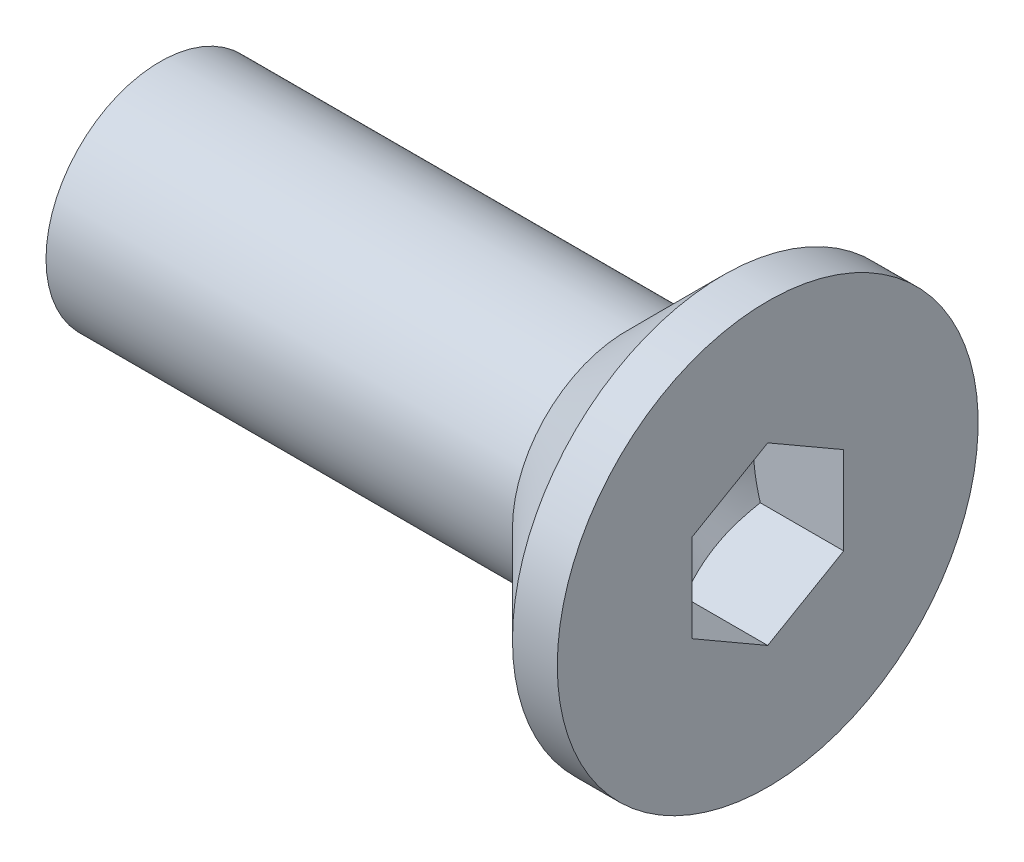
ISO-10303-21;
HEADER;
FILE_DESCRIPTION(('STEP AP214'),'2;1');
FILE_NAME('part.step','',(''),(''),'','','');
FILE_SCHEMA(('AUTOMOTIVE_DESIGN { 1 0 10303 214 1 1 1 1 }'));
ENDSEC;
DATA;
#1=APPLICATION_CONTEXT('core data for automotive mechanical design processes');
#2=APPLICATION_PROTOCOL_DEFINITION('international standard','automotive_design',2000,#1);
#3=PRODUCT_CONTEXT('',#1,'mechanical');
#4=PRODUCT('Part','Part','',(#3));
#5=PRODUCT_RELATED_PRODUCT_CATEGORY('part','',(#4));
#6=PRODUCT_DEFINITION_FORMATION('','',#4);
#7=PRODUCT_DEFINITION_CONTEXT('part definition',#1,'design');
#8=PRODUCT_DEFINITION('design','',#6,#7);
#9=PRODUCT_DEFINITION_SHAPE('','',#8);
#10=(LENGTH_UNIT() NAMED_UNIT(*) SI_UNIT(.MILLI.,.METRE.));
#11=(NAMED_UNIT(*) PLANE_ANGLE_UNIT() SI_UNIT($,.RADIAN.));
#12=(NAMED_UNIT(*) SI_UNIT($,.STERADIAN.) SOLID_ANGLE_UNIT());
#13=UNCERTAINTY_MEASURE_WITH_UNIT(LENGTH_MEASURE(1.E-05),#10,'distance_accuracy_value','');
#14=(GEOMETRIC_REPRESENTATION_CONTEXT(3) GLOBAL_UNCERTAINTY_ASSIGNED_CONTEXT((#13)) GLOBAL_UNIT_ASSIGNED_CONTEXT((#10,
#11,#12)) REPRESENTATION_CONTEXT('',''));
#15=CARTESIAN_POINT('',(0.,0.,0.));
#16=DIRECTION('',(0.,0.,1.));
#17=DIRECTION('',(1.,0.,0.));
#18=AXIS2_PLACEMENT_3D('',#15,#16,#17);
#19=CARTESIAN_POINT('',(1.86,2.77,0.));
#20=DIRECTION('',(-1.,0.,0.));
#21=DIRECTION('',(0.,0.,1.));
#22=AXIS2_PLACEMENT_3D('',#19,#20,#21);
#23=PLANE('',#22);
#24=CARTESIAN_POINT('',(1.86,0.,0.));
#25=DIRECTION('',(-1.,0.,0.));
#26=DIRECTION('',(0.,0.,1.));
#27=AXIS2_PLACEMENT_3D('',#24,#25,#26);
#28=CIRCLE('',#27,2.77);
#29=CARTESIAN_POINT('',(1.86,0.,2.77));
#30=VERTEX_POINT('',#29);
#31=EDGE_CURVE('E11',#30,#30,#28,.T.);
#32=ORIENTED_EDGE('',*,*,#31,.F.);
#33=EDGE_LOOP('',(#32));
#34=FACE_BOUND('',#33,.T.);
#35=DIRECTION('',(0.,1.,0.));
#36=VECTOR('',#35,1.);
#37=CARTESIAN_POINT('',(1.86,-0.577350269189628,1.));
#38=LINE('',#37,#36);
#39=CARTESIAN_POINT('',(1.86,-0.577350269189628,1.));
#40=VERTEX_POINT('',#39);
#41=CARTESIAN_POINT('',(1.86,0.577350269189626,1.));
#42=VERTEX_POINT('',#41);
#43=EDGE_CURVE('E121',#40,#42,#38,.T.);
#44=ORIENTED_EDGE('',*,*,#43,.T.);
#45=DIRECTION('',(0.,0.5,-0.866025403784439));
#46=VECTOR('',#45,1.);
#47=CARTESIAN_POINT('',(1.86,0.577350269189626,1.));
#48=LINE('',#47,#46);
#49=CARTESIAN_POINT('',(1.86,1.15470053837925,0.));
#50=VERTEX_POINT('',#49);
#51=EDGE_CURVE('E112',#42,#50,#48,.T.);
#52=ORIENTED_EDGE('',*,*,#51,.T.);
#53=DIRECTION('',(0.,-0.5,-0.866025403784439));
#54=VECTOR('',#53,1.);
#55=CARTESIAN_POINT('',(1.86,1.15470053837925,0.));
#56=LINE('',#55,#54);
#57=CARTESIAN_POINT('',(1.86,0.577350269189625,-1.));
#58=VERTEX_POINT('',#57);
#59=EDGE_CURVE('E54',#50,#58,#56,.T.);
#60=ORIENTED_EDGE('',*,*,#59,.T.);
#61=DIRECTION('',(0.,-1.,0.));
#62=VECTOR('',#61,1.);
#63=CARTESIAN_POINT('',(1.86,0.577350269189625,-1.));
#64=LINE('',#63,#62);
#65=CARTESIAN_POINT('',(1.86,-0.577350269189627,-1.));
#66=VERTEX_POINT('',#65);
#67=EDGE_CURVE('E101',#58,#66,#64,.T.);
#68=ORIENTED_EDGE('',*,*,#67,.T.);
#69=DIRECTION('',(0.,-0.5,0.866025403784438));
#70=VECTOR('',#69,1.);
#71=CARTESIAN_POINT('',(1.86,-0.577350269189627,-1.));
#72=LINE('',#71,#70);
#73=CARTESIAN_POINT('',(1.86,-1.15470053837925,0.));
#74=VERTEX_POINT('',#73);
#75=EDGE_CURVE('E107',#66,#74,#72,.T.);
#76=ORIENTED_EDGE('',*,*,#75,.T.);
#77=DIRECTION('',(0.,0.5,0.866025403784439));
#78=VECTOR('',#77,1.);
#79=CARTESIAN_POINT('',(1.86,-1.15470053837925,0.));
#80=LINE('',#79,#78);
#81=EDGE_CURVE('E118',#74,#40,#80,.T.);
#82=ORIENTED_EDGE('',*,*,#81,.T.);
#83=EDGE_LOOP('',(#44,#52,#60,#68,#76,#82));
#84=FACE_BOUND('',#83,.T.);
#85=ADVANCED_FACE('F39',(#34,#84),#23,.F.);
#86=CARTESIAN_POINT('',(0.,0.,0.));
#87=DIRECTION('',(-1.,0.,0.));
#88=DIRECTION('',(0.,0.,1.));
#89=AXIS2_PLACEMENT_3D('',#86,#87,#88);
#90=CYLINDRICAL_SURFACE('',#89,2.77);
#91=CARTESIAN_POINT('',(1.27000000000001,0.,0.));
#92=DIRECTION('',(-1.,0.,0.));
#93=DIRECTION('',(0.,0.,1.));
#94=AXIS2_PLACEMENT_3D('',#91,#92,#93);
#95=CIRCLE('',#94,2.77);
#96=CARTESIAN_POINT('',(1.27000000000001,0.,2.77));
#97=VERTEX_POINT('',#96);
#98=EDGE_CURVE('E140',#97,#97,#95,.T.);
#99=ORIENTED_EDGE('',*,*,#98,.F.);
#100=EDGE_LOOP('',(#99));
#101=FACE_BOUND('',#100,.T.);
#102=ORIENTED_EDGE('',*,*,#31,.T.);
#103=EDGE_LOOP('',(#102));
#104=FACE_BOUND('',#103,.T.);
#105=ADVANCED_FACE('F41',(#101,#104),#90,.T.);
#106=CARTESIAN_POINT('',(-6.14,1.5,0.));
#107=DIRECTION('',(1.,0.,0.));
#108=DIRECTION('',(0.,0.,-1.));
#109=AXIS2_PLACEMENT_3D('',#106,#107,#108);
#110=PLANE('',#109);
#111=CARTESIAN_POINT('',(-6.14,0.,0.));
#112=DIRECTION('',(-1.,0.,0.));
#113=DIRECTION('',(0.,0.,1.));
#114=AXIS2_PLACEMENT_3D('',#111,#112,#113);
#115=CIRCLE('',#114,1.5);
#116=CARTESIAN_POINT('',(-6.14,0.,1.5));
#117=VERTEX_POINT('',#116);
#118=EDGE_CURVE('E47',#117,#117,#115,.T.);
#119=ORIENTED_EDGE('',*,*,#118,.T.);
#120=EDGE_LOOP('',(#119));
#121=FACE_BOUND('',#120,.T.);
#122=ADVANCED_FACE('F212',(#121),#110,.F.);
#123=CARTESIAN_POINT('',(0.,0.,0.));
#124=DIRECTION('',(-1.,0.,0.));
#125=DIRECTION('',(0.,0.,1.));
#126=AXIS2_PLACEMENT_3D('',#123,#124,#125);
#127=CYLINDRICAL_SURFACE('',#126,1.5);
#128=ORIENTED_EDGE('',*,*,#118,.F.);
#129=EDGE_LOOP('',(#128));
#130=FACE_BOUND('',#129,.T.);
#131=CARTESIAN_POINT('',(0.,0.,0.));
#132=DIRECTION('',(-1.,0.,0.));
#133=DIRECTION('',(0.,0.,1.));
#134=AXIS2_PLACEMENT_3D('',#131,#132,#133);
#135=CIRCLE('',#134,1.5);
#136=CARTESIAN_POINT('',(0.,0.,1.5));
#137=VERTEX_POINT('',#136);
#138=EDGE_CURVE('E198',#137,#137,#135,.T.);
#139=ORIENTED_EDGE('',*,*,#138,.T.);
#140=EDGE_LOOP('',(#139));
#141=FACE_BOUND('',#140,.T.);
#142=ADVANCED_FACE('F217',(#130,#141),#127,.T.);
#143=CARTESIAN_POINT('',(1.27000000000001,0.,0.));
#144=DIRECTION('',(1.,0.,0.));
#145=DIRECTION('',(0.,0.,-1.));
#146=AXIS2_PLACEMENT_3D('',#143,#144,#145);
#147=CONICAL_SURFACE('',#146,2.77,0.785398163397443);
#148=ORIENTED_EDGE('',*,*,#138,.F.);
#149=EDGE_LOOP('',(#148));
#150=FACE_BOUND('',#149,.T.);
#151=ORIENTED_EDGE('',*,*,#98,.T.);
#152=EDGE_LOOP('',(#151));
#153=FACE_BOUND('',#152,.T.);
#154=ADVANCED_FACE('F149',(#150,#153),#147,.T.);
#155=CARTESIAN_POINT('',(-6.141,-0.577350269189628,1.));
#156=DIRECTION('',(0.,0.,-1.));
#157=DIRECTION('',(-1.,0.,0.));
#158=AXIS2_PLACEMENT_3D('',#155,#156,#157);
#159=PLANE('',#158);
#160=DIRECTION('',(1.,0.,0.));
#161=VECTOR('',#160,1.);
#162=CARTESIAN_POINT('',(-6.141,0.577350269189626,1.));
#163=LINE('',#162,#161);
#164=CARTESIAN_POINT('',(0.761847831694813,0.577350269189626,1.));
#165=VERTEX_POINT('',#164);
#166=EDGE_CURVE('E123',#165,#42,#163,.T.);
#167=ORIENTED_EDGE('',*,*,#166,.T.);
#168=ORIENTED_EDGE('',*,*,#43,.F.);
#169=DIRECTION('',(1.,0.,0.));
#170=VECTOR('',#169,1.);
#171=CARTESIAN_POINT('',(-6.141,-0.577350269189628,1.));
#172=LINE('',#171,#170);
#173=CARTESIAN_POINT('',(0.761847831694813,-0.577350269189628,1.));
#174=VERTEX_POINT('',#173);
#175=EDGE_CURVE('E125',#174,#40,#172,.T.);
#176=ORIENTED_EDGE('',*,*,#175,.F.);
#177=CARTESIAN_POINT('',(1.13470155202458,-1.4972668115415,1.));
#178=CARTESIAN_POINT('',(1.11394795183556,-1.45403242511268,1.));
#179=CARTESIAN_POINT('',(1.09341309620344,-1.41069350201854,1.));
#180=CARTESIAN_POINT('',(1.05289547294093,-1.32374923324724,1.));
#181=CARTESIAN_POINT('',(1.03291280447533,-1.2801438414112,1.));
#182=CARTESIAN_POINT('',(0.973740689861952,-1.1483408107056,1.));
#183=CARTESIAN_POINT('',(0.935578713223511,-1.05967319280394,1.));
#184=CARTESIAN_POINT('',(0.862625052841384,-0.878229407159381,1.));
#185=CARTESIAN_POINT('',(0.827948083823323,-0.785406482289062,1.));
#186=CARTESIAN_POINT('',(0.766226553406727,-0.597368678137685,1.));
#187=CARTESIAN_POINT('',(0.739162172146233,-0.502160726519804,1.));
#188=CARTESIAN_POINT('',(0.707774721788551,-0.357477087003658,1.));
#189=CARTESIAN_POINT('',(0.698853570405962,-0.309010925658943,1.));
#190=CARTESIAN_POINT('',(0.684679134389801,-0.211533626284625,1.));
#191=CARTESIAN_POINT('',(0.67942560009343,-0.162522525581033,1.));
#192=CARTESIAN_POINT('',(0.673073007871658,-0.0648156013345138,1.));
#193=CARTESIAN_POINT('',(0.671924809240934,-0.0161230613668046,1.));
#194=CARTESIAN_POINT('',(0.673748847480068,0.0811829191191967,1.));
#195=CARTESIAN_POINT('',(0.676721337846587,0.129796354586939,1.));
#196=CARTESIAN_POINT('',(0.688870471217975,0.249676910376862,1.));
#197=CARTESIAN_POINT('',(0.700326656505261,0.320713522834084,1.));
#198=CARTESIAN_POINT('',(0.729888437149097,0.461402014981034,1.));
#199=CARTESIAN_POINT('',(0.748002035154476,0.531052121336032,1.));
#200=CARTESIAN_POINT('',(0.78941063830138,0.670461827561067,1.));
#201=CARTESIAN_POINT('',(0.812812877634919,0.740188753468642,1.));
#202=CARTESIAN_POINT('',(0.863001704212052,0.87836158133238,1.));
#203=CARTESIAN_POINT('',(0.88978710910038,0.946807921281455,1.));
#204=CARTESIAN_POINT('',(0.961458948931291,1.12112860544657,1.));
#205=CARTESIAN_POINT('',(1.00802376627411,1.22630612909734,1.));
#206=CARTESIAN_POINT('',(1.10443312354616,1.43514882624416,1.));
#207=CARTESIAN_POINT('',(1.15427851208237,1.53881359988758,1.));
#208=CARTESIAN_POINT('',(1.25607811135395,1.74525765015519,1.));
#209=CARTESIAN_POINT('',(1.30803485088177,1.84803567483559,1.));
#210=CARTESIAN_POINT('',(1.41328199611614,2.05288630633546,1.));
#211=CARTESIAN_POINT('',(1.46657223094203,2.1549590014217,1.));
#212=CARTESIAN_POINT('',(1.56898869847587,2.34898167897334,1.));
#213=CARTESIAN_POINT('',(1.61803182613654,2.44097562379925,1.));
#214=CARTESIAN_POINT('',(1.71667677659352,2.62466751872505,1.));
#215=CARTESIAN_POINT('',(1.76627862023041,2.71636545761842,1.));
#216=CARTESIAN_POINT('',(1.86577374812209,2.89929932494578,1.));
#217=CARTESIAN_POINT('',(1.91566596387303,2.99053583520921,1.));
#218=CARTESIAN_POINT('',(2.01577505169675,3.17282438434648,1.));
#219=CARTESIAN_POINT('',(2.06599190653923,3.26387643267924,1.));
#220=CARTESIAN_POINT('',(2.11632775393233,3.35486223286697,1.));
#221=B_SPLINE_CURVE_WITH_KNOTS('',3,(#177,#178,#179,#180,#181,#182,#183,#184,#185,#186,#187,
#188,#189,#190,#191,#192,#193,#194,#195,#196,#197,#198,#199,#200,#201,#202,#203,#204,#205,#206,
#207,#208,#209,#210,#211,#212,#213,#214,#215,#216,#217,#218,#219,#220),.UNSPECIFIED.,.F.,.F.,(4,
2,2,2,2,2,2,2,2,2,2,2,2,2,2,2,2,2,2,2,2,4),(0.,0.143870262767033,0.287766196808272,
0.577282095818529,0.874395015101638,1.17072706631115,1.318453103392,1.46616908345433,
1.61211087672422,1.75806164844383,1.97347895840448,2.18915606562848,2.4096771434668,
2.63012136531511,2.97508265505191,3.32013353161017,3.66561061941326,4.01104366052871,
4.32379191958174,4.63655188330751,4.94851270458056,5.26045710219797),.UNSPECIFIED.);
#222=EDGE_CURVE('E131',#165,#174,#221,.F.);
#223=ORIENTED_EDGE('',*,*,#222,.F.);
#224=EDGE_LOOP('',(#167,#168,#176,#223));
#225=FACE_BOUND('',#224,.T.);
#226=ADVANCED_FACE('F144',(#225),#159,.T.);
#227=CARTESIAN_POINT('',(-6.141,-1.15470053837925,0.));
#228=DIRECTION('',(0.,0.866025403784439,-0.5));
#229=DIRECTION('',(0.,0.5,0.866025403784439));
#230=AXIS2_PLACEMENT_3D('',#227,#228,#229);
#231=PLANE('',#230);
#232=ORIENTED_EDGE('',*,*,#175,.T.);
#233=ORIENTED_EDGE('',*,*,#81,.F.);
#234=DIRECTION('',(1.,0.,0.));
#235=VECTOR('',#234,1.);
#236=CARTESIAN_POINT('',(-6.141,-1.15470053837925,0.));
#237=LINE('',#236,#235);
#238=CARTESIAN_POINT('',(0.761847831694814,-1.15470053837925,0.));
#239=VERTEX_POINT('',#238);
#240=EDGE_CURVE('E127',#239,#74,#237,.T.);
#241=ORIENTED_EDGE('',*,*,#240,.F.);
#242=CARTESIAN_POINT('',(0.76191450836048,-0.57723479913579,1.0002));
#243=CARTESIAN_POINT('',(0.74725680534396,-0.602607795820549,0.95625268060172));
#244=CARTESIAN_POINT('',(0.733925555315708,-0.628199807531659,0.911926016050179));
#245=CARTESIAN_POINT('',(0.710654339318269,-0.679827098330832,0.822504925328877));
#246=CARTESIAN_POINT('',(0.700722608244596,-0.70586329561416,0.777408908798268));
#247=CARTESIAN_POINT('',(0.685260526576893,-0.757612978088369,0.68777582947738));
#248=CARTESIAN_POINT('',(0.679627299793767,-0.783318495222184,0.64325256776678));
#249=CARTESIAN_POINT('',(0.672899120335068,-0.834850648373673,0.553996260284982));
#250=CARTESIAN_POINT('',(0.671798599616478,-0.860677096749783,0.509263539518505));
#251=CARTESIAN_POINT('',(0.674072883992952,-0.908946264126691,0.425658889182653));
#252=CARTESIAN_POINT('',(0.676889270558223,-0.931396163287558,0.386774523211233));
#253=CARTESIAN_POINT('',(0.685820281912164,-0.976149681982094,0.309259155014813));
#254=CARTESIAN_POINT('',(0.691937965449114,-0.998453146411452,0.27062842143836));
#255=CARTESIAN_POINT('',(0.707233557420637,-1.04329913914046,0.192952883515854));
#256=CARTESIAN_POINT('',(0.716476383863774,-1.0658359836813,0.153917923728832));
#257=CARTESIAN_POINT('',(0.737454677450344,-1.11057330008463,0.0764306187239873));
#258=CARTESIAN_POINT('',(0.749185206828477,-1.13277434629517,0.0379772787061402));
#259=CARTESIAN_POINT('',(0.76191450836048,-1.15481600843309,-0.000200000000000486));
#260=B_SPLINE_CURVE_WITH_KNOTS('',3,(#242,#243,#244,#245,#246,#247,#248,#249,#250,#251,#252,
#253,#254,#255,#256,#257,#258,#259),.UNSPECIFIED.,.F.,.F.,(4,2,2,2,2,2,2,2,4),(0.,
0.158523820030116,0.317428970089343,0.472400167924634,0.627180939971648,0.762016584872711,
0.896977373984233,1.03493410168667,1.17261952416172),.UNSPECIFIED.);
#261=EDGE_CURVE('E139',#174,#239,#260,.T.);
#262=ORIENTED_EDGE('',*,*,#261,.F.);
#263=EDGE_LOOP('',(#232,#233,#241,#262));
#264=FACE_BOUND('',#263,.T.);
#265=ADVANCED_FACE('F148',(#264),#231,.T.);
#266=CARTESIAN_POINT('',(-6.141,-0.577350269189627,-1.));
#267=DIRECTION('',(0.,0.866025403784438,0.5));
#268=DIRECTION('',(0.,-0.5,0.866025403784439));
#269=AXIS2_PLACEMENT_3D('',#266,#267,#268);
#270=PLANE('',#269);
#271=ORIENTED_EDGE('',*,*,#240,.T.);
#272=ORIENTED_EDGE('',*,*,#75,.F.);
#273=DIRECTION('',(1.,0.,0.));
#274=VECTOR('',#273,1.);
#275=CARTESIAN_POINT('',(-6.141,-0.577350269189627,-1.));
#276=LINE('',#275,#274);
#277=CARTESIAN_POINT('',(0.761847831694814,-0.577350269189627,-1.));
#278=VERTEX_POINT('',#277);
#279=EDGE_CURVE('E98',#278,#66,#276,.T.);
#280=ORIENTED_EDGE('',*,*,#279,.F.);
#281=CARTESIAN_POINT('',(0.761914508360481,-1.15481600843309,0.000199999999999349));
#282=CARTESIAN_POINT('',(0.747256805343961,-1.12944301174833,-0.0437473193982808));
#283=CARTESIAN_POINT('',(0.733925555315709,-1.10385100003722,-0.0880739839498211));
#284=CARTESIAN_POINT('',(0.710654339318269,-1.05222370923805,-0.177495074671123));
#285=CARTESIAN_POINT('',(0.700722608244596,-1.02618751195472,-0.222591091201732));
#286=CARTESIAN_POINT('',(0.685260526576893,-0.974437829480511,-0.31222417052262));
#287=CARTESIAN_POINT('',(0.679627299793768,-0.948732312346696,-0.35674743223322));
#288=CARTESIAN_POINT('',(0.672899120335068,-0.897200159195207,-0.446003739715018));
#289=CARTESIAN_POINT('',(0.671798599616478,-0.871373710819098,-0.490736460481496));
#290=CARTESIAN_POINT('',(0.674072883992952,-0.823104543442189,-0.574341110817348));
#291=CARTESIAN_POINT('',(0.676889270558223,-0.800654644281322,-0.613225476788767));
#292=CARTESIAN_POINT('',(0.685820281912164,-0.755901125586786,-0.690740844985187));
#293=CARTESIAN_POINT('',(0.691937965449113,-0.733597661157428,-0.72937157856164));
#294=CARTESIAN_POINT('',(0.707233557420637,-0.68875166842842,-0.807047116484146));
#295=CARTESIAN_POINT('',(0.716476383863774,-0.666214823887576,-0.846082076271168));
#296=CARTESIAN_POINT('',(0.737454677450344,-0.621477507484251,-0.923569381276013));
#297=CARTESIAN_POINT('',(0.749185206828477,-0.599276461273707,-0.96202272129386));
#298=CARTESIAN_POINT('',(0.76191450836048,-0.577234799135789,-1.0002));
#299=B_SPLINE_CURVE_WITH_KNOTS('',3,(#281,#282,#283,#284,#285,#286,#287,#288,#289,#290,#291,
#292,#293,#294,#295,#296,#297,#298),.UNSPECIFIED.,.F.,.F.,(4,2,2,2,2,2,2,2,4),(0.,
0.158523820030116,0.317428970089343,0.472400167924634,0.627180939971649,0.762016584872711,
0.896977373984233,1.03493410168667,1.17261952416172),.UNSPECIFIED.);
#300=EDGE_CURVE('E164',#239,#278,#299,.T.);
#301=ORIENTED_EDGE('',*,*,#300,.F.);
#302=EDGE_LOOP('',(#271,#272,#280,#301));
#303=FACE_BOUND('',#302,.T.);
#304=ADVANCED_FACE('F154',(#303),#270,.T.);
#305=CARTESIAN_POINT('',(-6.141,0.577350269189625,-1.));
#306=DIRECTION('',(0.,0.,1.));
#307=DIRECTION('',(0.,-1.,0.));
#308=AXIS2_PLACEMENT_3D('',#305,#306,#307);
#309=PLANE('',#308);
#310=ORIENTED_EDGE('',*,*,#279,.T.);
#311=ORIENTED_EDGE('',*,*,#67,.F.);
#312=DIRECTION('',(1.,0.,0.));
#313=VECTOR('',#312,1.);
#314=CARTESIAN_POINT('',(-6.141,0.577350269189625,-1.));
#315=LINE('',#314,#313);
#316=CARTESIAN_POINT('',(0.761847831694813,0.577350269189625,-1.));
#317=VERTEX_POINT('',#316);
#318=EDGE_CURVE('E92',#317,#58,#315,.T.);
#319=ORIENTED_EDGE('',*,*,#318,.F.);
#320=CARTESIAN_POINT('',(1.13470155225643,-1.49726681202441,-1.));
#321=CARTESIAN_POINT('',(1.11394795205742,-1.45403242557909,-1.));
#322=CARTESIAN_POINT('',(1.09341309641533,-1.41069350246843,-1.));
#323=CARTESIAN_POINT('',(1.05289547313292,-1.32374923366402,-1.));
#324=CARTESIAN_POINT('',(1.03291280465739,-1.28014384181141,-1.));
#325=CARTESIAN_POINT('',(0.973740690014158,-1.14834081105547,-1.));
#326=CARTESIAN_POINT('',(0.935578713355942,-1.05967319311994,-1.));
#327=CARTESIAN_POINT('',(0.862625052934697,-0.878229407405269,-1.));
#328=CARTESIAN_POINT('',(0.827948083897362,-0.785406482498684,-1.));
#329=CARTESIAN_POINT('',(0.766226553446001,-0.597368678273171,-1.));
#330=CARTESIAN_POINT('',(0.739162172169997,-0.502160726617426,-1.));
#331=CARTESIAN_POINT('',(0.70777472179459,-0.357477087037408,-1.));
#332=CARTESIAN_POINT('',(0.698853570406775,-0.309010925667502,-1.));
#333=CARTESIAN_POINT('',(0.684679134384074,-0.211533626242269,-1.));
#334=CARTESIAN_POINT('',(0.679425600086389,-0.162522525512956,-1.));
#335=CARTESIAN_POINT('',(0.673073007866498,-0.0648156012154716,-1.));
#336=CARTESIAN_POINT('',(0.671924809238896,-0.0161230612225218,-1.));
#337=CARTESIAN_POINT('',(0.673748847488462,0.0811829193134875,-1.));
#338=CARTESIAN_POINT('',(0.676721337862292,0.129796354805997,-1.));
#339=CARTESIAN_POINT('',(0.68887047125381,0.249676910636141,-1.));
#340=CARTESIAN_POINT('',(0.700326656553486,0.320713523108534,-1.));
#341=CARTESIAN_POINT('',(0.729888437222468,0.461402015284856,-1.));
#342=CARTESIAN_POINT('',(0.748002035240606,0.531052121654056,-1.));
#343=CARTESIAN_POINT('',(0.789410638412853,0.670461827907655,-1.));
#344=CARTESIAN_POINT('',(0.81281287775898,0.740188753829579,-1.));
#345=CARTESIAN_POINT('',(0.863001704360558,0.878361581721903,-1.));
#346=CARTESIAN_POINT('',(0.88978710926074,0.946807921685217,-1.));
#347=CARTESIAN_POINT('',(0.961458949110096,1.12112860585976,-1.));
#348=CARTESIAN_POINT('',(1.00802376645761,1.22630612950637,-1.));
#349=CARTESIAN_POINT('',(1.1044331237368,1.43514882664573,-1.));
#350=CARTESIAN_POINT('',(1.15427851227545,1.53881360028585,-1.));
#351=CARTESIAN_POINT('',(1.25607811155059,1.74525765054727,-1.));
#352=CARTESIAN_POINT('',(1.30803485107954,1.84803567522477,-1.));
#353=CARTESIAN_POINT('',(1.41328199631547,2.05288630671921,-1.));
#354=CARTESIAN_POINT('',(1.46657223114178,2.15495900180292,-1.));
#355=CARTESIAN_POINT('',(1.56898869867722,2.34898167935226,-1.));
#356=CARTESIAN_POINT('',(1.61803182633913,2.44097562417836,-1.));
#357=CARTESIAN_POINT('',(1.71667677679836,2.62466751910466,-1.));
#358=CARTESIAN_POINT('',(1.76627862043628,2.71636545799833,-1.));
#359=CARTESIAN_POINT('',(1.86577374833,2.89929932532666,-1.));
#360=CARTESIAN_POINT('',(1.91566596408196,2.99053583559074,-1.));
#361=CARTESIAN_POINT('',(2.01577505190763,3.17282438472941,-1.));
#362=CARTESIAN_POINT('',(2.06599190675102,3.26387643306289,-1.));
#363=CARTESIAN_POINT('',(2.11632775414502,3.35486223325137,-1.));
#364=B_SPLINE_CURVE_WITH_KNOTS('',3,(#320,#321,#322,#323,#324,#325,#326,#327,#328,#329,#330,
#331,#332,#333,#334,#335,#336,#337,#338,#339,#340,#341,#342,#343,#344,#345,#346,#347,#348,#349,
#350,#351,#352,#353,#354,#355,#356,#357,#358,#359,#360,#361,#362,#363),.UNSPECIFIED.,.F.,.F.,(4,
2,2,2,2,2,2,2,2,2,2,2,2,2,2,2,2,2,2,2,2,4),(0.,0.143870262824645,0.287766196923506,
0.57728209605056,0.874395015455798,1.17072706678677,1.3184531039446,1.46616908408381,
1.6121108774289,1.75806164922378,1.97347895923522,2.18915606651015,2.40967714440136,
2.63012136630245,2.9750826560337,3.32013353258624,3.66561062038312,4.01104366149243,
4.32379192054773,4.63655188427575,4.94851270555202,5.26045710317267),.UNSPECIFIED.);
#365=EDGE_CURVE('E170',#278,#317,#364,.T.);
#366=ORIENTED_EDGE('',*,*,#365,.F.);
#367=EDGE_LOOP('',(#310,#311,#319,#366));
#368=FACE_BOUND('',#367,.T.);
#369=ADVANCED_FACE('F102',(#368),#309,.T.);
#370=CARTESIAN_POINT('',(-6.141,1.15470053837925,0.));
#371=DIRECTION('',(0.,-0.866025403784438,0.5));
#372=DIRECTION('',(0.,-0.5,-0.866025403784439));
#373=AXIS2_PLACEMENT_3D('',#370,#371,#372);
#374=PLANE('',#373);
#375=ORIENTED_EDGE('',*,*,#318,.T.);
#376=ORIENTED_EDGE('',*,*,#59,.F.);
#377=DIRECTION('',(1.,0.,0.));
#378=VECTOR('',#377,1.);
#379=CARTESIAN_POINT('',(-6.141,1.15470053837925,0.));
#380=LINE('',#379,#378);
#381=CARTESIAN_POINT('',(0.761847831694813,1.15470053837925,0.));
#382=VERTEX_POINT('',#381);
#383=EDGE_CURVE('E97',#382,#50,#380,.T.);
#384=ORIENTED_EDGE('',*,*,#383,.F.);
#385=CARTESIAN_POINT('',(0.76191450836048,0.577234799135787,-1.0002));
#386=CARTESIAN_POINT('',(0.74725680534396,0.602607795820546,-0.95625268060172));
#387=CARTESIAN_POINT('',(0.733925555315708,0.628199807531657,-0.91192601605018));
#388=CARTESIAN_POINT('',(0.710654339318268,0.67982709833083,-0.822504925328878));
#389=CARTESIAN_POINT('',(0.700722608244595,0.705863295614157,-0.777408908798269));
#390=CARTESIAN_POINT('',(0.685260526576892,0.757612978088367,-0.687775829477381));
#391=CARTESIAN_POINT('',(0.679627299793767,0.783318495222182,-0.643252567766781));
#392=CARTESIAN_POINT('',(0.672899120335067,0.83485064837367,-0.553996260284983));
#393=CARTESIAN_POINT('',(0.671798599616477,0.86067709674978,-0.509263539518506));
#394=CARTESIAN_POINT('',(0.674072883992951,0.908946264126689,-0.425658889182654));
#395=CARTESIAN_POINT('',(0.676889270558222,0.931396163287556,-0.386774523211234));
#396=CARTESIAN_POINT('',(0.685820281912163,0.976149681982092,-0.309259155014814));
#397=CARTESIAN_POINT('',(0.691937965449112,0.99845314641145,-0.270628421438361));
#398=CARTESIAN_POINT('',(0.707233557420636,1.04329913914046,-0.192952883515855));
#399=CARTESIAN_POINT('',(0.716476383863773,1.0658359836813,-0.153917923728832));
#400=CARTESIAN_POINT('',(0.737454677450343,1.11057330008463,-0.0764306187239877));
#401=CARTESIAN_POINT('',(0.749185206828476,1.13277434629517,-0.0379772787061405));
#402=CARTESIAN_POINT('',(0.761914508360479,1.15481600843309,0.000200000000000161));
#403=B_SPLINE_CURVE_WITH_KNOTS('',3,(#385,#386,#387,#388,#389,#390,#391,#392,#393,#394,#395,
#396,#397,#398,#399,#400,#401,#402),.UNSPECIFIED.,.F.,.F.,(4,2,2,2,2,2,2,2,4),(0.,
0.158523820030115,0.317428970089343,0.472400167924633,0.627180939971648,0.762016584872711,
0.896977373984233,1.03493410168667,1.17261952416172),.UNSPECIFIED.);
#404=EDGE_CURVE('E59',#317,#382,#403,.T.);
#405=ORIENTED_EDGE('',*,*,#404,.F.);
#406=EDGE_LOOP('',(#375,#376,#384,#405));
#407=FACE_BOUND('',#406,.T.);
#408=ADVANCED_FACE('F94',(#407),#374,.T.);
#409=CARTESIAN_POINT('',(-6.141,0.577350269189626,1.));
#410=DIRECTION('',(0.,-0.866025403784439,-0.5));
#411=DIRECTION('',(0.,0.5,-0.866025403784439));
#412=AXIS2_PLACEMENT_3D('',#409,#410,#411);
#413=PLANE('',#412);
#414=ORIENTED_EDGE('',*,*,#383,.T.);
#415=ORIENTED_EDGE('',*,*,#51,.F.);
#416=ORIENTED_EDGE('',*,*,#166,.F.);
#417=CARTESIAN_POINT('',(0.761914508360479,1.15481600843309,-0.000199999999999829));
#418=CARTESIAN_POINT('',(0.74725680534396,1.12944301174833,0.0437473193982802));
#419=CARTESIAN_POINT('',(0.733925555315708,1.10385100003722,0.0880739839498206));
#420=CARTESIAN_POINT('',(0.710654339318268,1.05222370923805,0.177495074671122));
#421=CARTESIAN_POINT('',(0.700722608244595,1.02618751195472,0.222591091201731));
#422=CARTESIAN_POINT('',(0.685260526576892,0.97443782948051,0.312224170522619));
#423=CARTESIAN_POINT('',(0.679627299793766,0.948732312346694,0.35674743223322));
#424=CARTESIAN_POINT('',(0.672899120335067,0.897200159195206,0.446003739715017));
#425=CARTESIAN_POINT('',(0.671798599616477,0.871373710819096,0.490736460481495));
#426=CARTESIAN_POINT('',(0.674072883992951,0.823104543442188,0.574341110817347));
#427=CARTESIAN_POINT('',(0.676889270558223,0.80065464428132,0.613225476788766));
#428=CARTESIAN_POINT('',(0.685820281912163,0.755901125586784,0.690740844985186));
#429=CARTESIAN_POINT('',(0.691937965449112,0.733597661157427,0.729371578561639));
#430=CARTESIAN_POINT('',(0.707233557420636,0.688751668428419,0.807047116484145));
#431=CARTESIAN_POINT('',(0.716476383863773,0.666214823887575,0.846082076271167));
#432=CARTESIAN_POINT('',(0.737454677450343,0.62147750748425,0.923569381276012));
#433=CARTESIAN_POINT('',(0.749185206828476,0.599276461273706,0.962022721293859));
#434=CARTESIAN_POINT('',(0.761914508360479,0.577234799135788,1.0002));
#435=B_SPLINE_CURVE_WITH_KNOTS('',3,(#417,#418,#419,#420,#421,#422,#423,#424,#425,#426,#427,
#428,#429,#430,#431,#432,#433,#434),.UNSPECIFIED.,.F.,.F.,(4,2,2,2,2,2,2,2,4),(0.,
0.158523820030116,0.317428970089342,0.472400167924633,0.627180939971648,0.762016584872711,
0.896977373984232,1.03493410168667,1.17261952416172),.UNSPECIFIED.);
#436=EDGE_CURVE('E190',#382,#165,#435,.T.);
#437=ORIENTED_EDGE('',*,*,#436,.F.);
#438=EDGE_LOOP('',(#414,#415,#416,#437));
#439=FACE_BOUND('',#438,.T.);
#440=ADVANCED_FACE('F184',(#439),#413,.T.);
#441=CARTESIAN_POINT('',(0.76,0.,0.));
#442=DIRECTION('',(1.,0.,0.));
#443=DIRECTION('',(0.,1.,0.));
#444=AXIS2_PLACEMENT_3D('',#441,#442,#443);
#445=CONICAL_SURFACE('',#444,1.1515,1.0471975511966);
#446=CARTESIAN_POINT('',(0.0951811650281496,0.,0.));
#447=VERTEX_POINT('',#446);
#448=VERTEX_LOOP('',#447);
#449=FACE_BOUND('',#448,.T.);
#450=ORIENTED_EDGE('',*,*,#404,.T.);
#451=ORIENTED_EDGE('',*,*,#436,.T.);
#452=ORIENTED_EDGE('',*,*,#222,.T.);
#453=ORIENTED_EDGE('',*,*,#261,.T.);
#454=ORIENTED_EDGE('',*,*,#300,.T.);
#455=ORIENTED_EDGE('',*,*,#365,.T.);
#456=EDGE_LOOP('',(#450,#451,#452,#453,#454,#455));
#457=FACE_BOUND('',#456,.T.);
#458=ADVANCED_FACE('F142',(#449,#457),#445,.F.);
#459=CLOSED_SHELL('',(#85,#105,#122,#142,#154,#226,#265,#304,#369,#408,#440,#458));
#460=MANIFOLD_SOLID_BREP('B2',#459);
#461=ADVANCED_BREP_SHAPE_REPRESENTATION('',(#18,#460),#14);
#462=SHAPE_DEFINITION_REPRESENTATION(#9,#461);
ENDSEC;
END-ISO-10303-21;
